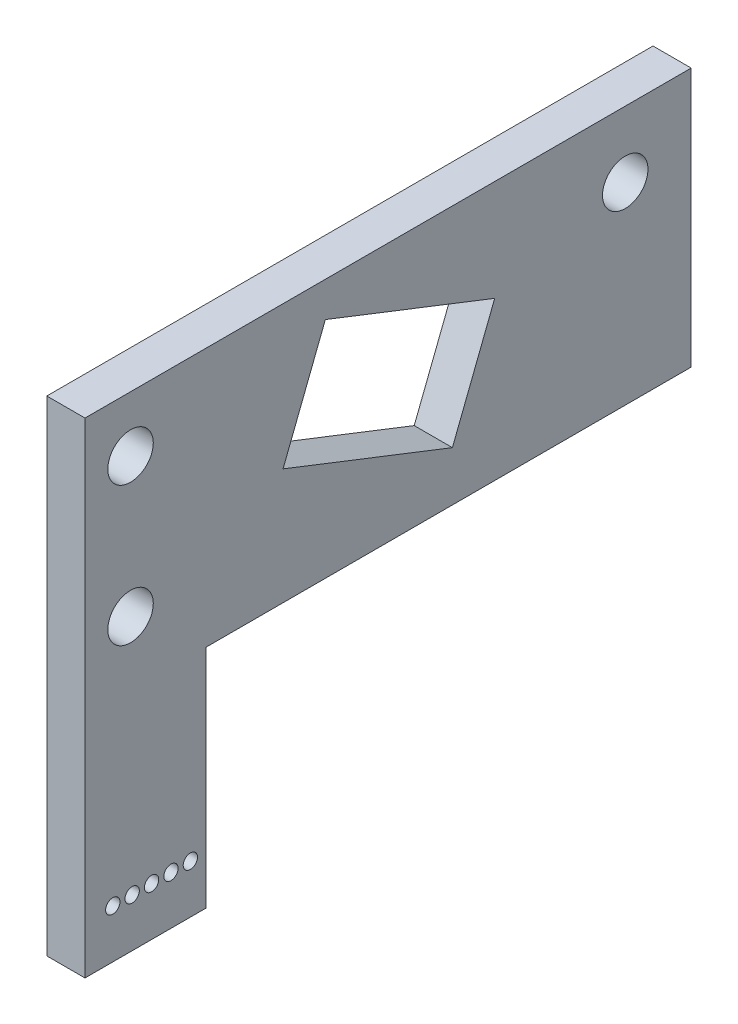
ISO-10303-21;
HEADER;
FILE_DESCRIPTION(('STEP AP214'),'2;1');
FILE_NAME('part.step','',(''),(''),'','','');
FILE_SCHEMA(('AUTOMOTIVE_DESIGN { 1 0 10303 214 1 1 1 1 }'));
ENDSEC;
DATA;
#1=APPLICATION_CONTEXT('core data for automotive mechanical design processes');
#2=APPLICATION_PROTOCOL_DEFINITION('international standard','automotive_design',2000,#1);
#3=PRODUCT_CONTEXT('',#1,'mechanical');
#4=PRODUCT('Part','Part','',(#3));
#5=PRODUCT_RELATED_PRODUCT_CATEGORY('part','',(#4));
#6=PRODUCT_DEFINITION_FORMATION('','',#4);
#7=PRODUCT_DEFINITION_CONTEXT('part definition',#1,'design');
#8=PRODUCT_DEFINITION('design','',#6,#7);
#9=PRODUCT_DEFINITION_SHAPE('','',#8);
#10=(LENGTH_UNIT() NAMED_UNIT(*) SI_UNIT(.MILLI.,.METRE.));
#11=(NAMED_UNIT(*) PLANE_ANGLE_UNIT() SI_UNIT($,.RADIAN.));
#12=(NAMED_UNIT(*) SI_UNIT($,.STERADIAN.) SOLID_ANGLE_UNIT());
#13=UNCERTAINTY_MEASURE_WITH_UNIT(LENGTH_MEASURE(1.E-05),#10,'distance_accuracy_value','');
#14=(GEOMETRIC_REPRESENTATION_CONTEXT(3) GLOBAL_UNCERTAINTY_ASSIGNED_CONTEXT((#13)) GLOBAL_UNIT_ASSIGNED_CONTEXT((#10,
#11,#12)) REPRESENTATION_CONTEXT('',''));
#15=CARTESIAN_POINT('',(0.,0.,0.));
#16=DIRECTION('',(0.,0.,1.));
#17=DIRECTION('',(1.,0.,0.));
#18=AXIS2_PLACEMENT_3D('',#15,#16,#17);
#19=CARTESIAN_POINT('',(2.,0.,0.));
#20=DIRECTION('',(1.,0.,0.));
#21=DIRECTION('',(0.,0.,-1.));
#22=AXIS2_PLACEMENT_3D('',#19,#20,#21);
#23=PLANE('',#22);
#24=CARTESIAN_POINT('',(2.,-38.8104127217883,51.6489582242048));
#25=DIRECTION('',(1.,0.,0.));
#26=DIRECTION('',(0.,0.,-1.));
#27=AXIS2_PLACEMENT_3D('',#24,#25,#26);
#28=CIRCLE('',#27,0.749999999999999);
#29=CARTESIAN_POINT('',(2.,-38.8104127217883,50.8989582242048));
#30=VERTEX_POINT('',#29);
#31=EDGE_CURVE('E307',#30,#30,#28,.T.);
#32=ORIENTED_EDGE('',*,*,#31,.F.);
#33=EDGE_LOOP('',(#32));
#34=FACE_BOUND('',#33,.T.);
#35=CARTESIAN_POINT('',(2.,-38.8104127217883,47.5849582242048));
#36=DIRECTION('',(1.,0.,0.));
#37=DIRECTION('',(0.,0.,-1.));
#38=AXIS2_PLACEMENT_3D('',#35,#36,#37);
#39=CIRCLE('',#38,0.749999999999999);
#40=CARTESIAN_POINT('',(2.,-38.8104127217883,46.8349582242048));
#41=VERTEX_POINT('',#40);
#42=EDGE_CURVE('E319',#41,#41,#39,.T.);
#43=ORIENTED_EDGE('',*,*,#42,.F.);
#44=EDGE_LOOP('',(#43));
#45=FACE_BOUND('',#44,.T.);
#46=CARTESIAN_POINT('',(2.,-38.8104127217883,45.5529582242048));
#47=DIRECTION('',(1.,0.,0.));
#48=DIRECTION('',(0.,0.,-1.));
#49=AXIS2_PLACEMENT_3D('',#46,#47,#48);
#50=CIRCLE('',#49,0.749999999999999);
#51=CARTESIAN_POINT('',(2.,-38.8104127217883,44.8029582242048));
#52=VERTEX_POINT('',#51);
#53=EDGE_CURVE('E143',#52,#52,#50,.T.);
#54=ORIENTED_EDGE('',*,*,#53,.F.);
#55=EDGE_LOOP('',(#54));
#56=FACE_BOUND('',#55,.T.);
#57=CARTESIAN_POINT('',(2.,0.,0.));
#58=DIRECTION('',(1.,0.,0.));
#59=DIRECTION('',(0.,0.,-1.));
#60=AXIS2_PLACEMENT_3D('',#57,#58,#59);
#61=CIRCLE('',#60,2.38125);
#62=CARTESIAN_POINT('',(2.,0.,-2.38125));
#63=VERTEX_POINT('',#62);
#64=EDGE_CURVE('E159',#63,#63,#61,.T.);
#65=ORIENTED_EDGE('',*,*,#64,.F.);
#66=EDGE_LOOP('',(#65));
#67=FACE_BOUND('',#66,.T.);
#68=DIRECTION('',(0.,-1.,0.));
#69=VECTOR('',#68,1.);
#70=CARTESIAN_POINT('',(2.,6.90958727821171,56.5904127217883));
#71=LINE('',#70,#69);
#72=CARTESIAN_POINT('',(2.,6.90958727821171,56.5904127217883));
#73=VERTEX_POINT('',#72);
#74=CARTESIAN_POINT('',(2.,-43.8904127217883,56.5904127217883));
#75=VERTEX_POINT('',#74);
#76=EDGE_CURVE('E165',#73,#75,#71,.T.);
#77=ORIENTED_EDGE('',*,*,#76,.T.);
#78=DIRECTION('',(0.,0.,-1.));
#79=VECTOR('',#78,1.);
#80=CARTESIAN_POINT('',(2.,-43.8904127217883,56.5904127217883));
#81=LINE('',#80,#79);
#82=CARTESIAN_POINT('',(2.,-43.8904127217883,43.8904127217883));
#83=VERTEX_POINT('',#82);
#84=EDGE_CURVE('E168',#75,#83,#81,.T.);
#85=ORIENTED_EDGE('',*,*,#84,.T.);
#86=DIRECTION('',(0.,1.,0.));
#87=VECTOR('',#86,1.);
#88=CARTESIAN_POINT('',(2.,-43.8904127217883,43.8904127217883));
#89=LINE('',#88,#87);
#90=CARTESIAN_POINT('',(2.,-20.2220575827776,43.8904127217883));
#91=VERTEX_POINT('',#90);
#92=EDGE_CURVE('E171',#83,#91,#89,.T.);
#93=ORIENTED_EDGE('',*,*,#92,.T.);
#94=DIRECTION('',(0.,0.,-1.));
#95=VECTOR('',#94,1.);
#96=CARTESIAN_POINT('',(2.,-20.2220575827776,43.8904127217883));
#97=LINE('',#96,#95);
#98=CARTESIAN_POINT('',(2.,-20.2220575827776,-6.90958727821172));
#99=VERTEX_POINT('',#98);
#100=EDGE_CURVE('E173',#91,#99,#97,.T.);
#101=ORIENTED_EDGE('',*,*,#100,.T.);
#102=DIRECTION('',(0.,1.,0.));
#103=VECTOR('',#102,1.);
#104=CARTESIAN_POINT('',(2.,-20.2220575827776,-6.90958727821172));
#105=LINE('',#104,#103);
#106=CARTESIAN_POINT('',(2.,6.90958727821172,-6.90958727821172));
#107=VERTEX_POINT('',#106);
#108=EDGE_CURVE('E175',#99,#107,#105,.T.);
#109=ORIENTED_EDGE('',*,*,#108,.T.);
#110=DIRECTION('',(0.,0.,1.));
#111=VECTOR('',#110,1.);
#112=CARTESIAN_POINT('',(2.,6.90958727821172,-6.90958727821172));
#113=LINE('',#112,#111);
#114=EDGE_CURVE('E177',#107,#73,#113,.T.);
#115=ORIENTED_EDGE('',*,*,#114,.T.);
#116=EDGE_LOOP('',(#77,#85,#93,#101,#109,#115));
#117=FACE_BOUND('',#116,.T.);
#118=CARTESIAN_POINT('',(2.,-38.8104127217883,53.6809582242048));
#119=DIRECTION('',(1.,0.,0.));
#120=DIRECTION('',(0.,0.,-1.));
#121=AXIS2_PLACEMENT_3D('',#118,#119,#120);
#122=CIRCLE('',#121,0.749999999999999);
#123=CARTESIAN_POINT('',(2.,-38.8104127217883,52.9309582242048));
#124=VERTEX_POINT('',#123);
#125=EDGE_CURVE('E153',#124,#124,#122,.T.);
#126=ORIENTED_EDGE('',*,*,#125,.F.);
#127=EDGE_LOOP('',(#126));
#128=FACE_BOUND('',#127,.T.);
#129=DIRECTION('',(0.,-0.364399348580512,-0.931242779705754));
#130=VECTOR('',#129,1.);
#131=CARTESIAN_POINT('',(2.,-8.07647614364657,35.8456887850451));
#132=LINE('',#131,#130);
#133=CARTESIAN_POINT('',(2.,-8.07647614364657,35.8456887850451));
#134=VERTEX_POINT('',#133);
#135=CARTESIAN_POINT('',(2.,-15.0182837341053,18.1055138316505));
#136=VERTEX_POINT('',#135);
#137=EDGE_CURVE('E122',#134,#136,#132,.T.);
#138=ORIENTED_EDGE('',*,*,#137,.F.);
#139=DIRECTION('',(0.,-0.931242779705754,0.364399348580512));
#140=VECTOR('',#139,1.);
#141=CARTESIAN_POINT('',(2.,3.25072622690581,31.413305248742));
#142=LINE('',#141,#140);
#143=CARTESIAN_POINT('',(2.,3.25072622690581,31.413305248742));
#144=VERTEX_POINT('',#143);
#145=EDGE_CURVE('E114',#144,#134,#142,.T.);
#146=ORIENTED_EDGE('',*,*,#145,.F.);
#147=DIRECTION('',(0.,0.364399348580512,0.931242779705754));
#148=VECTOR('',#147,1.);
#149=CARTESIAN_POINT('',(2.,3.25072622690581,31.413305248742));
#150=LINE('',#149,#148);
#151=CARTESIAN_POINT('',(2.,-3.69108136355294,13.6731302953474));
#152=VERTEX_POINT('',#151);
#153=EDGE_CURVE('E137',#152,#144,#150,.T.);
#154=ORIENTED_EDGE('',*,*,#153,.F.);
#155=DIRECTION('',(0.,0.931242779705754,-0.364399348580512));
#156=VECTOR('',#155,1.);
#157=CARTESIAN_POINT('',(2.,-3.69108136355294,13.6731302953474));
#158=LINE('',#157,#156);
#159=EDGE_CURVE('E135',#136,#152,#158,.T.);
#160=ORIENTED_EDGE('',*,*,#159,.F.);
#161=EDGE_LOOP('',(#138,#146,#154,#160));
#162=FACE_BOUND('',#161,.T.);
#163=CARTESIAN_POINT('',(2.,-13.4841494163715,51.8181121525116));
#164=DIRECTION('',(1.,0.,0.));
#165=DIRECTION('',(0.,0.,-1.));
#166=AXIS2_PLACEMENT_3D('',#163,#164,#165);
#167=CIRCLE('',#166,2.38125);
#168=CARTESIAN_POINT('',(2.,-13.4841494163715,49.4368621525116));
#169=VERTEX_POINT('',#168);
#170=EDGE_CURVE('E325',#169,#169,#167,.T.);
#171=ORIENTED_EDGE('',*,*,#170,.F.);
#172=EDGE_LOOP('',(#171));
#173=FACE_BOUND('',#172,.T.);
#174=CARTESIAN_POINT('',(2.,-38.8104127217883,49.6169582242048));
#175=DIRECTION('',(1.,0.,0.));
#176=DIRECTION('',(0.,0.,-1.));
#177=AXIS2_PLACEMENT_3D('',#174,#175,#176);
#178=CIRCLE('',#177,0.749999999999999);
#179=CARTESIAN_POINT('',(2.,-38.8104127217883,48.8669582242048));
#180=VERTEX_POINT('',#179);
#181=EDGE_CURVE('E313',#180,#180,#178,.T.);
#182=ORIENTED_EDGE('',*,*,#181,.F.);
#183=EDGE_LOOP('',(#182));
#184=FACE_BOUND('',#183,.T.);
#185=CARTESIAN_POINT('',(2.,1.07937569190719,51.8181121525116));
#186=DIRECTION('',(1.,0.,0.));
#187=DIRECTION('',(0.,0.,-1.));
#188=AXIS2_PLACEMENT_3D('',#185,#186,#187);
#189=CIRCLE('',#188,2.38125);
#190=CARTESIAN_POINT('',(2.,1.07937569190719,49.4368621525116));
#191=VERTEX_POINT('',#190);
#192=EDGE_CURVE('E298',#191,#191,#189,.T.);
#193=ORIENTED_EDGE('',*,*,#192,.F.);
#194=EDGE_LOOP('',(#193));
#195=FACE_BOUND('',#194,.T.);
#196=ADVANCED_FACE('F37',(#34,#45,#56,#67,#117,#128,#162,#173,#184,#195),#23,.T.);
#197=CARTESIAN_POINT('',(-2.,0.,0.));
#198=DIRECTION('',(1.,0.,0.));
#199=DIRECTION('',(0.,0.,-1.));
#200=AXIS2_PLACEMENT_3D('',#197,#198,#199);
#201=PLANE('',#200);
#202=CARTESIAN_POINT('',(-2.,-38.8104127217883,53.6809582242048));
#203=DIRECTION('',(1.,0.,0.));
#204=DIRECTION('',(0.,0.,-1.));
#205=AXIS2_PLACEMENT_3D('',#202,#203,#204);
#206=CIRCLE('',#205,0.749999999999999);
#207=CARTESIAN_POINT('',(-2.,-38.8104127217883,52.9309582242048));
#208=VERTEX_POINT('',#207);
#209=EDGE_CURVE('E130',#208,#208,#206,.T.);
#210=ORIENTED_EDGE('',*,*,#209,.T.);
#211=EDGE_LOOP('',(#210));
#212=FACE_BOUND('',#211,.T.);
#213=CARTESIAN_POINT('',(-2.,0.,0.));
#214=DIRECTION('',(1.,0.,0.));
#215=DIRECTION('',(0.,0.,-1.));
#216=AXIS2_PLACEMENT_3D('',#213,#214,#215);
#217=CIRCLE('',#216,2.38125);
#218=CARTESIAN_POINT('',(-2.,0.,-2.38125));
#219=VERTEX_POINT('',#218);
#220=EDGE_CURVE('E156',#219,#219,#217,.T.);
#221=ORIENTED_EDGE('',*,*,#220,.T.);
#222=EDGE_LOOP('',(#221));
#223=FACE_BOUND('',#222,.T.);
#224=DIRECTION('',(0.,-1.,0.));
#225=VECTOR('',#224,1.);
#226=CARTESIAN_POINT('',(-2.,6.90958727821171,56.5904127217883));
#227=LINE('',#226,#225);
#228=CARTESIAN_POINT('',(-2.,6.90958727821171,56.5904127217883));
#229=VERTEX_POINT('',#228);
#230=CARTESIAN_POINT('',(-2.,-43.8904127217883,56.5904127217883));
#231=VERTEX_POINT('',#230);
#232=EDGE_CURVE('E162',#229,#231,#227,.T.);
#233=ORIENTED_EDGE('',*,*,#232,.F.);
#234=DIRECTION('',(0.,0.,1.));
#235=VECTOR('',#234,1.);
#236=CARTESIAN_POINT('',(-2.,6.90958727821172,-6.90958727821172));
#237=LINE('',#236,#235);
#238=CARTESIAN_POINT('',(-2.,6.90958727821172,-6.90958727821172));
#239=VERTEX_POINT('',#238);
#240=EDGE_CURVE('E169',#239,#229,#237,.T.);
#241=ORIENTED_EDGE('',*,*,#240,.F.);
#242=DIRECTION('',(0.,1.,0.));
#243=VECTOR('',#242,1.);
#244=CARTESIAN_POINT('',(-2.,-20.2220575827776,-6.90958727821172));
#245=LINE('',#244,#243);
#246=CARTESIAN_POINT('',(-2.,-20.2220575827776,-6.90958727821172));
#247=VERTEX_POINT('',#246);
#248=EDGE_CURVE('E188',#247,#239,#245,.T.);
#249=ORIENTED_EDGE('',*,*,#248,.F.);
#250=DIRECTION('',(0.,0.,-1.));
#251=VECTOR('',#250,1.);
#252=CARTESIAN_POINT('',(-2.,-20.2220575827776,43.8904127217883));
#253=LINE('',#252,#251);
#254=CARTESIAN_POINT('',(-2.,-20.2220575827776,43.8904127217883));
#255=VERTEX_POINT('',#254);
#256=EDGE_CURVE('E186',#255,#247,#253,.T.);
#257=ORIENTED_EDGE('',*,*,#256,.F.);
#258=DIRECTION('',(0.,1.,0.));
#259=VECTOR('',#258,1.);
#260=CARTESIAN_POINT('',(-2.,-43.8904127217883,43.8904127217883));
#261=LINE('',#260,#259);
#262=CARTESIAN_POINT('',(-2.,-43.8904127217883,43.8904127217883));
#263=VERTEX_POINT('',#262);
#264=EDGE_CURVE('E184',#263,#255,#261,.T.);
#265=ORIENTED_EDGE('',*,*,#264,.F.);
#266=DIRECTION('',(0.,0.,-1.));
#267=VECTOR('',#266,1.);
#268=CARTESIAN_POINT('',(-2.,-43.8904127217883,56.5904127217883));
#269=LINE('',#268,#267);
#270=EDGE_CURVE('E182',#231,#263,#269,.T.);
#271=ORIENTED_EDGE('',*,*,#270,.F.);
#272=EDGE_LOOP('',(#233,#241,#249,#257,#265,#271));
#273=FACE_BOUND('',#272,.T.);
#274=DIRECTION('',(0.,-0.931242779705754,0.364399348580512));
#275=VECTOR('',#274,1.);
#276=CARTESIAN_POINT('',(-2.,3.25072622690581,31.413305248742));
#277=LINE('',#276,#275);
#278=CARTESIAN_POINT('',(-2.,3.25072622690581,31.413305248742));
#279=VERTEX_POINT('',#278);
#280=CARTESIAN_POINT('',(-2.,-8.07647614364657,35.8456887850451));
#281=VERTEX_POINT('',#280);
#282=EDGE_CURVE('E60',#279,#281,#277,.T.);
#283=ORIENTED_EDGE('',*,*,#282,.T.);
#284=DIRECTION('',(0.,-0.364399348580512,-0.931242779705754));
#285=VECTOR('',#284,1.);
#286=CARTESIAN_POINT('',(-2.,-8.07647614364657,35.8456887850451));
#287=LINE('',#286,#285);
#288=CARTESIAN_POINT('',(-2.,-15.0182837341053,18.1055138316505));
#289=VERTEX_POINT('',#288);
#290=EDGE_CURVE('E129',#281,#289,#287,.T.);
#291=ORIENTED_EDGE('',*,*,#290,.T.);
#292=DIRECTION('',(0.,0.931242779705754,-0.364399348580512));
#293=VECTOR('',#292,1.);
#294=CARTESIAN_POINT('',(-2.,-3.69108136355294,13.6731302953474));
#295=LINE('',#294,#293);
#296=CARTESIAN_POINT('',(-2.,-3.69108136355294,13.6731302953474));
#297=VERTEX_POINT('',#296);
#298=EDGE_CURVE('E145',#289,#297,#295,.T.);
#299=ORIENTED_EDGE('',*,*,#298,.T.);
#300=DIRECTION('',(0.,0.364399348580512,0.931242779705754));
#301=VECTOR('',#300,1.);
#302=CARTESIAN_POINT('',(-2.,3.25072622690581,31.413305248742));
#303=LINE('',#302,#301);
#304=EDGE_CURVE('E123',#297,#279,#303,.T.);
#305=ORIENTED_EDGE('',*,*,#304,.T.);
#306=EDGE_LOOP('',(#283,#291,#299,#305));
#307=FACE_BOUND('',#306,.T.);
#308=CARTESIAN_POINT('',(-2.,-38.8104127217883,45.5529582242048));
#309=DIRECTION('',(1.,0.,0.));
#310=DIRECTION('',(0.,0.,-1.));
#311=AXIS2_PLACEMENT_3D('',#308,#309,#310);
#312=CIRCLE('',#311,0.749999999999999);
#313=CARTESIAN_POINT('',(-2.,-38.8104127217883,44.8029582242048));
#314=VERTEX_POINT('',#313);
#315=EDGE_CURVE('E328',#314,#314,#312,.T.);
#316=ORIENTED_EDGE('',*,*,#315,.T.);
#317=EDGE_LOOP('',(#316));
#318=FACE_BOUND('',#317,.T.);
#319=CARTESIAN_POINT('',(-2.,-13.4841494163715,51.8181121525116));
#320=DIRECTION('',(1.,0.,0.));
#321=DIRECTION('',(0.,0.,-1.));
#322=AXIS2_PLACEMENT_3D('',#319,#320,#321);
#323=CIRCLE('',#322,2.38125);
#324=CARTESIAN_POINT('',(-2.,-13.4841494163715,49.4368621525116));
#325=VERTEX_POINT('',#324);
#326=EDGE_CURVE('E322',#325,#325,#323,.T.);
#327=ORIENTED_EDGE('',*,*,#326,.T.);
#328=EDGE_LOOP('',(#327));
#329=FACE_BOUND('',#328,.T.);
#330=CARTESIAN_POINT('',(-2.,-38.8104127217883,47.5849582242048));
#331=DIRECTION('',(1.,0.,0.));
#332=DIRECTION('',(0.,0.,-1.));
#333=AXIS2_PLACEMENT_3D('',#330,#331,#332);
#334=CIRCLE('',#333,0.749999999999999);
#335=CARTESIAN_POINT('',(-2.,-38.8104127217883,46.8349582242048));
#336=VERTEX_POINT('',#335);
#337=EDGE_CURVE('E316',#336,#336,#334,.T.);
#338=ORIENTED_EDGE('',*,*,#337,.T.);
#339=EDGE_LOOP('',(#338));
#340=FACE_BOUND('',#339,.T.);
#341=CARTESIAN_POINT('',(-2.,-38.8104127217883,49.6169582242048));
#342=DIRECTION('',(1.,0.,0.));
#343=DIRECTION('',(0.,0.,-1.));
#344=AXIS2_PLACEMENT_3D('',#341,#342,#343);
#345=CIRCLE('',#344,0.749999999999999);
#346=CARTESIAN_POINT('',(-2.,-38.8104127217883,48.8669582242048));
#347=VERTEX_POINT('',#346);
#348=EDGE_CURVE('E310',#347,#347,#345,.T.);
#349=ORIENTED_EDGE('',*,*,#348,.T.);
#350=EDGE_LOOP('',(#349));
#351=FACE_BOUND('',#350,.T.);
#352=CARTESIAN_POINT('',(-2.,-38.8104127217883,51.6489582242048));
#353=DIRECTION('',(1.,0.,0.));
#354=DIRECTION('',(0.,0.,-1.));
#355=AXIS2_PLACEMENT_3D('',#352,#353,#354);
#356=CIRCLE('',#355,0.749999999999999);
#357=CARTESIAN_POINT('',(-2.,-38.8104127217883,50.8989582242048));
#358=VERTEX_POINT('',#357);
#359=EDGE_CURVE('E304',#358,#358,#356,.T.);
#360=ORIENTED_EDGE('',*,*,#359,.T.);
#361=EDGE_LOOP('',(#360));
#362=FACE_BOUND('',#361,.T.);
#363=CARTESIAN_POINT('',(-2.,1.07937569190719,51.8181121525116));
#364=DIRECTION('',(1.,0.,0.));
#365=DIRECTION('',(0.,0.,-1.));
#366=AXIS2_PLACEMENT_3D('',#363,#364,#365);
#367=CIRCLE('',#366,2.38125);
#368=CARTESIAN_POINT('',(-2.,1.07937569190719,49.4368621525116));
#369=VERTEX_POINT('',#368);
#370=EDGE_CURVE('E301',#369,#369,#367,.T.);
#371=ORIENTED_EDGE('',*,*,#370,.T.);
#372=EDGE_LOOP('',(#371));
#373=FACE_BOUND('',#372,.T.);
#374=ADVANCED_FACE('F212',(#212,#223,#273,#307,#318,#329,#340,#351,#362,#373),#201,.F.);
#375=CARTESIAN_POINT('',(2.,6.90958727821171,56.5904127217883));
#376=DIRECTION('',(0.,0.,-1.));
#377=DIRECTION('',(0.,1.,0.));
#378=AXIS2_PLACEMENT_3D('',#375,#376,#377);
#379=PLANE('',#378);
#380=ORIENTED_EDGE('',*,*,#232,.T.);
#381=DIRECTION('',(-1.,0.,0.));
#382=VECTOR('',#381,1.);
#383=CARTESIAN_POINT('',(2.,-43.8904127217883,56.5904127217883));
#384=LINE('',#383,#382);
#385=EDGE_CURVE('E11',#75,#231,#384,.T.);
#386=ORIENTED_EDGE('',*,*,#385,.F.);
#387=ORIENTED_EDGE('',*,*,#76,.F.);
#388=DIRECTION('',(-1.,0.,0.));
#389=VECTOR('',#388,1.);
#390=CARTESIAN_POINT('',(2.,6.90958727821171,56.5904127217883));
#391=LINE('',#390,#389);
#392=EDGE_CURVE('E179',#73,#229,#391,.T.);
#393=ORIENTED_EDGE('',*,*,#392,.T.);
#394=EDGE_LOOP('',(#380,#386,#387,#393));
#395=FACE_BOUND('',#394,.T.);
#396=ADVANCED_FACE('F39',(#395),#379,.F.);
#397=CARTESIAN_POINT('',(2.,-43.8904127217883,56.5904127217883));
#398=DIRECTION('',(0.,1.,0.));
#399=DIRECTION('',(0.,0.,1.));
#400=AXIS2_PLACEMENT_3D('',#397,#398,#399);
#401=PLANE('',#400);
#402=ORIENTED_EDGE('',*,*,#270,.T.);
#403=DIRECTION('',(-1.,0.,0.));
#404=VECTOR('',#403,1.);
#405=CARTESIAN_POINT('',(2.,-43.8904127217883,43.8904127217883));
#406=LINE('',#405,#404);
#407=EDGE_CURVE('E45',#83,#263,#406,.T.);
#408=ORIENTED_EDGE('',*,*,#407,.F.);
#409=ORIENTED_EDGE('',*,*,#84,.F.);
#410=ORIENTED_EDGE('',*,*,#385,.T.);
#411=EDGE_LOOP('',(#402,#408,#409,#410));
#412=FACE_BOUND('',#411,.T.);
#413=ADVANCED_FACE('F230',(#412),#401,.F.);
#414=CARTESIAN_POINT('',(2.,-43.8904127217883,43.8904127217883));
#415=DIRECTION('',(0.,0.,1.));
#416=DIRECTION('',(1.,0.,0.));
#417=AXIS2_PLACEMENT_3D('',#414,#415,#416);
#418=PLANE('',#417);
#419=ORIENTED_EDGE('',*,*,#264,.T.);
#420=DIRECTION('',(-1.,0.,0.));
#421=VECTOR('',#420,1.);
#422=CARTESIAN_POINT('',(2.,-20.2220575827776,43.8904127217883));
#423=LINE('',#422,#421);
#424=EDGE_CURVE('E199',#91,#255,#423,.T.);
#425=ORIENTED_EDGE('',*,*,#424,.F.);
#426=ORIENTED_EDGE('',*,*,#92,.F.);
#427=ORIENTED_EDGE('',*,*,#407,.T.);
#428=EDGE_LOOP('',(#419,#425,#426,#427));
#429=FACE_BOUND('',#428,.T.);
#430=ADVANCED_FACE('F206',(#429),#418,.F.);
#431=CARTESIAN_POINT('',(2.,-20.2220575827776,43.8904127217883));
#432=DIRECTION('',(0.,1.,0.));
#433=DIRECTION('',(0.,0.,1.));
#434=AXIS2_PLACEMENT_3D('',#431,#432,#433);
#435=PLANE('',#434);
#436=ORIENTED_EDGE('',*,*,#256,.T.);
#437=DIRECTION('',(-1.,0.,0.));
#438=VECTOR('',#437,1.);
#439=CARTESIAN_POINT('',(2.,-20.2220575827776,-6.90958727821172));
#440=LINE('',#439,#438);
#441=EDGE_CURVE('E196',#99,#247,#440,.T.);
#442=ORIENTED_EDGE('',*,*,#441,.F.);
#443=ORIENTED_EDGE('',*,*,#100,.F.);
#444=ORIENTED_EDGE('',*,*,#424,.T.);
#445=EDGE_LOOP('',(#436,#442,#443,#444));
#446=FACE_BOUND('',#445,.T.);
#447=ADVANCED_FACE('F218',(#446),#435,.F.);
#448=CARTESIAN_POINT('',(2.,-20.2220575827776,-6.90958727821172));
#449=DIRECTION('',(0.,0.,1.));
#450=DIRECTION('',(1.,0.,0.));
#451=AXIS2_PLACEMENT_3D('',#448,#449,#450);
#452=PLANE('',#451);
#453=ORIENTED_EDGE('',*,*,#248,.T.);
#454=DIRECTION('',(-1.,0.,0.));
#455=VECTOR('',#454,1.);
#456=CARTESIAN_POINT('',(2.,6.90958727821172,-6.90958727821172));
#457=LINE('',#456,#455);
#458=EDGE_CURVE('E193',#107,#239,#457,.T.);
#459=ORIENTED_EDGE('',*,*,#458,.F.);
#460=ORIENTED_EDGE('',*,*,#108,.F.);
#461=ORIENTED_EDGE('',*,*,#441,.T.);
#462=EDGE_LOOP('',(#453,#459,#460,#461));
#463=FACE_BOUND('',#462,.T.);
#464=ADVANCED_FACE('F222',(#463),#452,.F.);
#465=CARTESIAN_POINT('',(2.,6.90958727821172,-6.90958727821172));
#466=DIRECTION('',(0.,-1.,0.));
#467=DIRECTION('',(0.,0.,-1.));
#468=AXIS2_PLACEMENT_3D('',#465,#466,#467);
#469=PLANE('',#468);
#470=ORIENTED_EDGE('',*,*,#240,.T.);
#471=ORIENTED_EDGE('',*,*,#392,.F.);
#472=ORIENTED_EDGE('',*,*,#114,.F.);
#473=ORIENTED_EDGE('',*,*,#458,.T.);
#474=EDGE_LOOP('',(#470,#471,#472,#473));
#475=FACE_BOUND('',#474,.T.);
#476=ADVANCED_FACE('F233',(#475),#469,.F.);
#477=CARTESIAN_POINT('',(2.,0.,0.));
#478=DIRECTION('',(-1.,0.,0.));
#479=DIRECTION('',(0.,0.,1.));
#480=AXIS2_PLACEMENT_3D('',#477,#478,#479);
#481=CYLINDRICAL_SURFACE('',#480,2.38125);
#482=ORIENTED_EDGE('',*,*,#64,.T.);
#483=EDGE_LOOP('',(#482));
#484=FACE_BOUND('',#483,.T.);
#485=ORIENTED_EDGE('',*,*,#220,.F.);
#486=EDGE_LOOP('',(#485));
#487=FACE_BOUND('',#486,.T.);
#488=ADVANCED_FACE('F235',(#484,#487),#481,.F.);
#489=CARTESIAN_POINT('',(2.,-38.8104127217883,53.6809582242048));
#490=DIRECTION('',(-1.,0.,0.));
#491=DIRECTION('',(0.,0.,1.));
#492=AXIS2_PLACEMENT_3D('',#489,#490,#491);
#493=CYLINDRICAL_SURFACE('',#492,0.749999999999999);
#494=ORIENTED_EDGE('',*,*,#125,.T.);
#495=EDGE_LOOP('',(#494));
#496=FACE_BOUND('',#495,.T.);
#497=ORIENTED_EDGE('',*,*,#209,.F.);
#498=EDGE_LOOP('',(#497));
#499=FACE_BOUND('',#498,.T.);
#500=ADVANCED_FACE('F241',(#496,#499),#493,.F.);
#501=CARTESIAN_POINT('',(2.,3.25072622690581,31.413305248742));
#502=DIRECTION('',(0.,-0.364399348580512,-0.931242779705754));
#503=DIRECTION('',(0.,0.931242779705754,-0.364399348580512));
#504=AXIS2_PLACEMENT_3D('',#501,#502,#503);
#505=PLANE('',#504);
#506=ORIENTED_EDGE('',*,*,#282,.F.);
#507=DIRECTION('',(-1.,0.,0.));
#508=VECTOR('',#507,1.);
#509=CARTESIAN_POINT('',(2.,3.25072622690581,31.413305248742));
#510=LINE('',#509,#508);
#511=EDGE_CURVE('E118',#144,#279,#510,.T.);
#512=ORIENTED_EDGE('',*,*,#511,.F.);
#513=ORIENTED_EDGE('',*,*,#145,.T.);
#514=DIRECTION('',(-1.,0.,0.));
#515=VECTOR('',#514,1.);
#516=CARTESIAN_POINT('',(2.,-8.07647614364657,35.8456887850451));
#517=LINE('',#516,#515);
#518=EDGE_CURVE('E117',#134,#281,#517,.T.);
#519=ORIENTED_EDGE('',*,*,#518,.T.);
#520=EDGE_LOOP('',(#506,#512,#513,#519));
#521=FACE_BOUND('',#520,.T.);
#522=ADVANCED_FACE('F116',(#521),#505,.T.);
#523=CARTESIAN_POINT('',(2.,-8.07647614364657,35.8456887850451));
#524=DIRECTION('',(0.,0.931242779705754,-0.364399348580512));
#525=DIRECTION('',(0.,0.364399348580512,0.931242779705754));
#526=AXIS2_PLACEMENT_3D('',#523,#524,#525);
#527=PLANE('',#526);
#528=ORIENTED_EDGE('',*,*,#290,.F.);
#529=ORIENTED_EDGE('',*,*,#518,.F.);
#530=ORIENTED_EDGE('',*,*,#137,.T.);
#531=DIRECTION('',(-1.,0.,0.));
#532=VECTOR('',#531,1.);
#533=CARTESIAN_POINT('',(2.,-15.0182837341053,18.1055138316505));
#534=LINE('',#533,#532);
#535=EDGE_CURVE('E131',#136,#289,#534,.T.);
#536=ORIENTED_EDGE('',*,*,#535,.T.);
#537=EDGE_LOOP('',(#528,#529,#530,#536));
#538=FACE_BOUND('',#537,.T.);
#539=ADVANCED_FACE('F126',(#538),#527,.T.);
#540=CARTESIAN_POINT('',(2.,-3.69108136355294,13.6731302953474));
#541=DIRECTION('',(0.,0.364399348580512,0.931242779705754));
#542=DIRECTION('',(0.,-0.931242779705754,0.364399348580512));
#543=AXIS2_PLACEMENT_3D('',#540,#541,#542);
#544=PLANE('',#543);
#545=ORIENTED_EDGE('',*,*,#298,.F.);
#546=ORIENTED_EDGE('',*,*,#535,.F.);
#547=ORIENTED_EDGE('',*,*,#159,.T.);
#548=DIRECTION('',(-1.,0.,0.));
#549=VECTOR('',#548,1.);
#550=CARTESIAN_POINT('',(2.,-3.69108136355294,13.6731302953474));
#551=LINE('',#550,#549);
#552=EDGE_CURVE('E52',#152,#297,#551,.T.);
#553=ORIENTED_EDGE('',*,*,#552,.T.);
#554=EDGE_LOOP('',(#545,#546,#547,#553));
#555=FACE_BOUND('',#554,.T.);
#556=ADVANCED_FACE('F263',(#555),#544,.T.);
#557=CARTESIAN_POINT('',(2.,3.25072622690581,31.413305248742));
#558=DIRECTION('',(0.,-0.931242779705754,0.364399348580512));
#559=DIRECTION('',(0.,-0.364399348580512,-0.931242779705754));
#560=AXIS2_PLACEMENT_3D('',#557,#558,#559);
#561=PLANE('',#560);
#562=ORIENTED_EDGE('',*,*,#304,.F.);
#563=ORIENTED_EDGE('',*,*,#552,.F.);
#564=ORIENTED_EDGE('',*,*,#153,.T.);
#565=ORIENTED_EDGE('',*,*,#511,.T.);
#566=EDGE_LOOP('',(#562,#563,#564,#565));
#567=FACE_BOUND('',#566,.T.);
#568=ADVANCED_FACE('F266',(#567),#561,.T.);
#569=CARTESIAN_POINT('',(2.,-38.8104127217883,45.5529582242048));
#570=DIRECTION('',(-1.,0.,0.));
#571=DIRECTION('',(0.,0.,1.));
#572=AXIS2_PLACEMENT_3D('',#569,#570,#571);
#573=CYLINDRICAL_SURFACE('',#572,0.749999999999999);
#574=ORIENTED_EDGE('',*,*,#53,.T.);
#575=EDGE_LOOP('',(#574));
#576=FACE_BOUND('',#575,.T.);
#577=ORIENTED_EDGE('',*,*,#315,.F.);
#578=EDGE_LOOP('',(#577));
#579=FACE_BOUND('',#578,.T.);
#580=ADVANCED_FACE('F270',(#576,#579),#573,.F.);
#581=CARTESIAN_POINT('',(2.,-13.4841494163715,51.8181121525116));
#582=DIRECTION('',(-1.,0.,0.));
#583=DIRECTION('',(0.,0.,1.));
#584=AXIS2_PLACEMENT_3D('',#581,#582,#583);
#585=CYLINDRICAL_SURFACE('',#584,2.38125);
#586=ORIENTED_EDGE('',*,*,#170,.T.);
#587=EDGE_LOOP('',(#586));
#588=FACE_BOUND('',#587,.T.);
#589=ORIENTED_EDGE('',*,*,#326,.F.);
#590=EDGE_LOOP('',(#589));
#591=FACE_BOUND('',#590,.T.);
#592=ADVANCED_FACE('F273',(#588,#591),#585,.F.);
#593=CARTESIAN_POINT('',(2.,-38.8104127217883,47.5849582242048));
#594=DIRECTION('',(-1.,0.,0.));
#595=DIRECTION('',(0.,0.,1.));
#596=AXIS2_PLACEMENT_3D('',#593,#594,#595);
#597=CYLINDRICAL_SURFACE('',#596,0.749999999999999);
#598=ORIENTED_EDGE('',*,*,#42,.T.);
#599=EDGE_LOOP('',(#598));
#600=FACE_BOUND('',#599,.T.);
#601=ORIENTED_EDGE('',*,*,#337,.F.);
#602=EDGE_LOOP('',(#601));
#603=FACE_BOUND('',#602,.T.);
#604=ADVANCED_FACE('F277',(#600,#603),#597,.F.);
#605=CARTESIAN_POINT('',(2.,-38.8104127217883,49.6169582242048));
#606=DIRECTION('',(-1.,0.,0.));
#607=DIRECTION('',(0.,0.,1.));
#608=AXIS2_PLACEMENT_3D('',#605,#606,#607);
#609=CYLINDRICAL_SURFACE('',#608,0.749999999999999);
#610=ORIENTED_EDGE('',*,*,#181,.T.);
#611=EDGE_LOOP('',(#610));
#612=FACE_BOUND('',#611,.T.);
#613=ORIENTED_EDGE('',*,*,#348,.F.);
#614=EDGE_LOOP('',(#613));
#615=FACE_BOUND('',#614,.T.);
#616=ADVANCED_FACE('F281',(#612,#615),#609,.F.);
#617=CARTESIAN_POINT('',(2.,-38.8104127217883,51.6489582242048));
#618=DIRECTION('',(-1.,0.,0.));
#619=DIRECTION('',(0.,0.,1.));
#620=AXIS2_PLACEMENT_3D('',#617,#618,#619);
#621=CYLINDRICAL_SURFACE('',#620,0.749999999999999);
#622=ORIENTED_EDGE('',*,*,#31,.T.);
#623=EDGE_LOOP('',(#622));
#624=FACE_BOUND('',#623,.T.);
#625=ORIENTED_EDGE('',*,*,#359,.F.);
#626=EDGE_LOOP('',(#625));
#627=FACE_BOUND('',#626,.T.);
#628=ADVANCED_FACE('F285',(#624,#627),#621,.F.);
#629=CARTESIAN_POINT('',(2.,1.07937569190719,51.8181121525116));
#630=DIRECTION('',(-1.,0.,0.));
#631=DIRECTION('',(0.,0.,1.));
#632=AXIS2_PLACEMENT_3D('',#629,#630,#631);
#633=CYLINDRICAL_SURFACE('',#632,2.38125);
#634=ORIENTED_EDGE('',*,*,#192,.T.);
#635=EDGE_LOOP('',(#634));
#636=FACE_BOUND('',#635,.T.);
#637=ORIENTED_EDGE('',*,*,#370,.F.);
#638=EDGE_LOOP('',(#637));
#639=FACE_BOUND('',#638,.T.);
#640=ADVANCED_FACE('F289',(#636,#639),#633,.F.);
#641=CLOSED_SHELL('',(#196,#374,#396,#413,#430,#447,#464,#476,#488,#500,#522,#539,#556,#568,
#580,#592,#604,#616,#628,#640));
#642=MANIFOLD_SOLID_BREP('B2',#641);
#643=ADVANCED_BREP_SHAPE_REPRESENTATION('',(#18,#642),#14);
#644=SHAPE_DEFINITION_REPRESENTATION(#9,#643);
ENDSEC;
END-ISO-10303-21;
